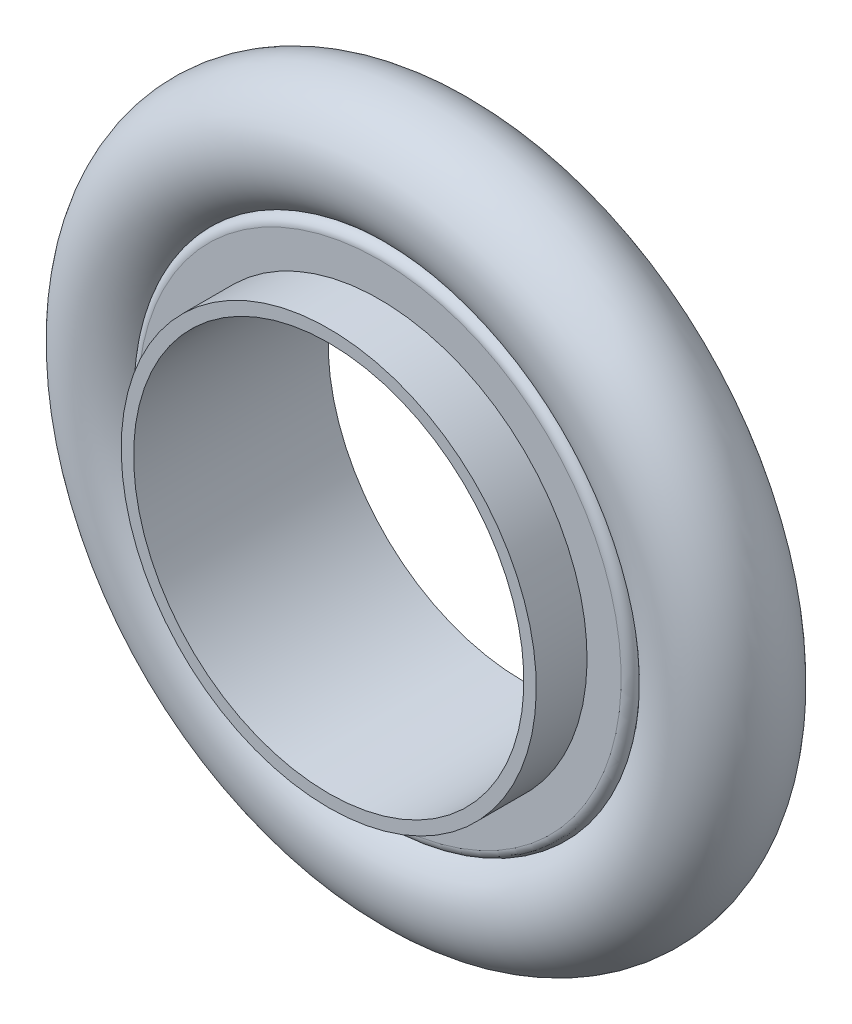
ISO-10303-21;
HEADER;
FILE_DESCRIPTION(('STEP AP214'),'2;1');
FILE_NAME('part.step','',(''),(''),'','','');
FILE_SCHEMA(('AUTOMOTIVE_DESIGN { 1 0 10303 214 1 1 1 1 }'));
ENDSEC;
DATA;
#1=APPLICATION_CONTEXT('core data for automotive mechanical design processes');
#2=APPLICATION_PROTOCOL_DEFINITION('international standard','automotive_design',2000,#1);
#3=PRODUCT_CONTEXT('',#1,'mechanical');
#4=PRODUCT('Part','Part','',(#3));
#5=PRODUCT_RELATED_PRODUCT_CATEGORY('part','',(#4));
#6=PRODUCT_DEFINITION_FORMATION('','',#4);
#7=PRODUCT_DEFINITION_CONTEXT('part definition',#1,'design');
#8=PRODUCT_DEFINITION('design','',#6,#7);
#9=PRODUCT_DEFINITION_SHAPE('','',#8);
#10=(LENGTH_UNIT() NAMED_UNIT(*) SI_UNIT(.MILLI.,.METRE.));
#11=(NAMED_UNIT(*) PLANE_ANGLE_UNIT() SI_UNIT($,.RADIAN.));
#12=(NAMED_UNIT(*) SI_UNIT($,.STERADIAN.) SOLID_ANGLE_UNIT());
#13=UNCERTAINTY_MEASURE_WITH_UNIT(LENGTH_MEASURE(1.E-05),#10,'distance_accuracy_value','');
#14=(GEOMETRIC_REPRESENTATION_CONTEXT(3) GLOBAL_UNCERTAINTY_ASSIGNED_CONTEXT((#13)) GLOBAL_UNIT_ASSIGNED_CONTEXT((#10,
#11,#12)) REPRESENTATION_CONTEXT('',''));
#15=CARTESIAN_POINT('',(0.,0.,0.));
#16=DIRECTION('',(0.,0.,1.));
#17=DIRECTION('',(1.,0.,0.));
#18=AXIS2_PLACEMENT_3D('',#15,#16,#17);
#19=CARTESIAN_POINT('',(0.,0.,0.));
#20=DIRECTION('',(0.,0.,1.));
#21=DIRECTION('',(0.,-1.,0.));
#22=AXIS2_PLACEMENT_3D('',#19,#20,#21);
#23=TOROIDAL_SURFACE('',#22,12.1613372824156,2.41572271758437);
#24=CARTESIAN_POINT('',(0.,-14.57706,0.));
#25=VERTEX_POINT('',#24);
#26=VERTEX_LOOP('',#25);
#27=FACE_BOUND('',#26,.T.);
#28=ADVANCED_FACE('F47',(#27),#23,.T.);
#29=CLOSED_SHELL('',(#28));
#30=MANIFOLD_SOLID_BREP('B2',#29);
#31=CARTESIAN_POINT('',(0.,0.,0.));
#32=DIRECTION('',(0.,0.,1.));
#33=DIRECTION('',(0.,-1.,0.));
#34=AXIS2_PLACEMENT_3D('',#31,#32,#33);
#35=TOROIDAL_SURFACE('',#34,12.1613372824156,2.41572271758437);
#36=CARTESIAN_POINT('',(0.,0.,1.524));
#37=DIRECTION('',(0.,0.,1.));
#38=DIRECTION('',(0.,-1.,0.));
#39=AXIS2_PLACEMENT_3D('',#36,#37,#38);
#40=CIRCLE('',#39,10.287);
#41=CARTESIAN_POINT('',(0.,-10.287,1.524));
#42=VERTEX_POINT('',#41);
#43=EDGE_CURVE('E46',#42,#42,#40,.T.);
#44=ORIENTED_EDGE('',*,*,#43,.F.);
#45=EDGE_LOOP('',(#44));
#46=FACE_BOUND('',#45,.T.);
#47=CARTESIAN_POINT('',(0.,0.,-1.524));
#48=DIRECTION('',(0.,0.,1.));
#49=DIRECTION('',(0.,-1.,0.));
#50=AXIS2_PLACEMENT_3D('',#47,#48,#49);
#51=CIRCLE('',#50,10.287);
#52=CARTESIAN_POINT('',(0.,-10.287,-1.524));
#53=VERTEX_POINT('',#52);
#54=EDGE_CURVE('E96',#53,#53,#51,.T.);
#55=ORIENTED_EDGE('',*,*,#54,.T.);
#56=EDGE_LOOP('',(#55));
#57=FACE_BOUND('',#56,.T.);
#58=ADVANCED_FACE('F62',(#46,#57),#35,.F.);
#59=CARTESIAN_POINT('',(0.,0.,1.524));
#60=DIRECTION('',(0.,0.,1.));
#61=DIRECTION('',(0.,-1.,0.));
#62=AXIS2_PLACEMENT_3D('',#59,#60,#61);
#63=TOROIDAL_SURFACE('',#62,9.90600000000001,0.380999999999998);
#64=CARTESIAN_POINT('',(0.,0.,1.905));
#65=DIRECTION('',(0.,0.,1.));
#66=DIRECTION('',(0.,-1.,0.));
#67=AXIS2_PLACEMENT_3D('',#64,#65,#66);
#68=CIRCLE('',#67,9.90600000000001);
#69=CARTESIAN_POINT('',(0.,-9.90600000000001,1.905));
#70=VERTEX_POINT('',#69);
#71=EDGE_CURVE('E68',#70,#70,#68,.T.);
#72=ORIENTED_EDGE('',*,*,#71,.F.);
#73=EDGE_LOOP('',(#72));
#74=FACE_BOUND('',#73,.T.);
#75=ORIENTED_EDGE('',*,*,#43,.T.);
#76=EDGE_LOOP('',(#75));
#77=FACE_BOUND('',#76,.T.);
#78=ADVANCED_FACE('F145',(#74,#77),#63,.T.);
#79=CARTESIAN_POINT('',(0.,8.509,1.905));
#80=DIRECTION('',(0.,0.,-1.));
#81=DIRECTION('',(0.,1.,0.));
#82=AXIS2_PLACEMENT_3D('',#79,#80,#81);
#83=PLANE('',#82);
#84=CARTESIAN_POINT('',(0.,0.,1.905));
#85=DIRECTION('',(0.,0.,1.));
#86=DIRECTION('',(0.,-1.,0.));
#87=AXIS2_PLACEMENT_3D('',#84,#85,#86);
#88=CIRCLE('',#87,8.509);
#89=CARTESIAN_POINT('',(0.,-8.509,1.905));
#90=VERTEX_POINT('',#89);
#91=EDGE_CURVE('E72',#90,#90,#88,.T.);
#92=ORIENTED_EDGE('',*,*,#91,.F.);
#93=EDGE_LOOP('',(#92));
#94=FACE_BOUND('',#93,.T.);
#95=ORIENTED_EDGE('',*,*,#71,.T.);
#96=EDGE_LOOP('',(#95));
#97=FACE_BOUND('',#96,.T.);
#98=ADVANCED_FACE('F140',(#94,#97),#83,.F.);
#99=CARTESIAN_POINT('',(0.,0.,3.9878));
#100=DIRECTION('',(0.,0.,1.));
#101=DIRECTION('',(0.,-1.,0.));
#102=AXIS2_PLACEMENT_3D('',#99,#100,#101);
#103=CYLINDRICAL_SURFACE('',#102,8.509);
#104=CARTESIAN_POINT('',(0.,0.,3.9878));
#105=DIRECTION('',(0.,0.,1.));
#106=DIRECTION('',(0.,-1.,0.));
#107=AXIS2_PLACEMENT_3D('',#104,#105,#106);
#108=CIRCLE('',#107,8.509);
#109=CARTESIAN_POINT('',(0.,-8.509,3.9878));
#110=VERTEX_POINT('',#109);
#111=EDGE_CURVE('E76',#110,#110,#108,.T.);
#112=ORIENTED_EDGE('',*,*,#111,.F.);
#113=EDGE_LOOP('',(#112));
#114=FACE_BOUND('',#113,.T.);
#115=ORIENTED_EDGE('',*,*,#91,.T.);
#116=EDGE_LOOP('',(#115));
#117=FACE_BOUND('',#116,.T.);
#118=ADVANCED_FACE('F134',(#114,#117),#103,.T.);
#119=CARTESIAN_POINT('',(0.,8.001,3.9878));
#120=DIRECTION('',(0.,0.,-1.));
#121=DIRECTION('',(0.,1.,0.));
#122=AXIS2_PLACEMENT_3D('',#119,#120,#121);
#123=PLANE('',#122);
#124=CARTESIAN_POINT('',(0.,0.,3.9878));
#125=DIRECTION('',(0.,0.,1.));
#126=DIRECTION('',(0.,-1.,0.));
#127=AXIS2_PLACEMENT_3D('',#124,#125,#126);
#128=CIRCLE('',#127,8.001);
#129=CARTESIAN_POINT('',(0.,-8.001,3.9878));
#130=VERTEX_POINT('',#129);
#131=EDGE_CURVE('E81',#130,#130,#128,.T.);
#132=ORIENTED_EDGE('',*,*,#131,.F.);
#133=EDGE_LOOP('',(#132));
#134=FACE_BOUND('',#133,.T.);
#135=ORIENTED_EDGE('',*,*,#111,.T.);
#136=EDGE_LOOP('',(#135));
#137=FACE_BOUND('',#136,.T.);
#138=ADVANCED_FACE('F128',(#134,#137),#123,.F.);
#139=CARTESIAN_POINT('',(0.,0.,3.9878));
#140=DIRECTION('',(0.,0.,1.));
#141=DIRECTION('',(0.,-1.,0.));
#142=AXIS2_PLACEMENT_3D('',#139,#140,#141);
#143=CYLINDRICAL_SURFACE('',#142,8.001);
#144=CARTESIAN_POINT('',(0.,0.,-3.9878));
#145=DIRECTION('',(0.,0.,1.));
#146=DIRECTION('',(0.,-1.,0.));
#147=AXIS2_PLACEMENT_3D('',#144,#145,#146);
#148=CIRCLE('',#147,8.001);
#149=CARTESIAN_POINT('',(0.,-8.001,-3.9878));
#150=VERTEX_POINT('',#149);
#151=EDGE_CURVE('E84',#150,#150,#148,.T.);
#152=ORIENTED_EDGE('',*,*,#151,.F.);
#153=EDGE_LOOP('',(#152));
#154=FACE_BOUND('',#153,.T.);
#155=ORIENTED_EDGE('',*,*,#131,.T.);
#156=EDGE_LOOP('',(#155));
#157=FACE_BOUND('',#156,.T.);
#158=ADVANCED_FACE('F122',(#154,#157),#143,.F.);
#159=CARTESIAN_POINT('',(0.,8.001,-3.9878));
#160=DIRECTION('',(0.,0.,1.));
#161=DIRECTION('',(0.,-1.,0.));
#162=AXIS2_PLACEMENT_3D('',#159,#160,#161);
#163=PLANE('',#162);
#164=CARTESIAN_POINT('',(0.,0.,-3.9878));
#165=DIRECTION('',(0.,0.,1.));
#166=DIRECTION('',(0.,-1.,0.));
#167=AXIS2_PLACEMENT_3D('',#164,#165,#166);
#168=CIRCLE('',#167,8.509);
#169=CARTESIAN_POINT('',(0.,-8.509,-3.9878));
#170=VERTEX_POINT('',#169);
#171=EDGE_CURVE('E87',#170,#170,#168,.T.);
#172=ORIENTED_EDGE('',*,*,#171,.F.);
#173=EDGE_LOOP('',(#172));
#174=FACE_BOUND('',#173,.T.);
#175=ORIENTED_EDGE('',*,*,#151,.T.);
#176=EDGE_LOOP('',(#175));
#177=FACE_BOUND('',#176,.T.);
#178=ADVANCED_FACE('F116',(#174,#177),#163,.F.);
#179=CARTESIAN_POINT('',(0.,0.,3.9878));
#180=DIRECTION('',(0.,0.,1.));
#181=DIRECTION('',(0.,-1.,0.));
#182=AXIS2_PLACEMENT_3D('',#179,#180,#181);
#183=CYLINDRICAL_SURFACE('',#182,8.509);
#184=CARTESIAN_POINT('',(0.,0.,-1.905));
#185=DIRECTION('',(0.,0.,1.));
#186=DIRECTION('',(0.,-1.,0.));
#187=AXIS2_PLACEMENT_3D('',#184,#185,#186);
#188=CIRCLE('',#187,8.509);
#189=CARTESIAN_POINT('',(0.,-8.509,-1.905));
#190=VERTEX_POINT('',#189);
#191=EDGE_CURVE('E90',#190,#190,#188,.T.);
#192=ORIENTED_EDGE('',*,*,#191,.F.);
#193=EDGE_LOOP('',(#192));
#194=FACE_BOUND('',#193,.T.);
#195=ORIENTED_EDGE('',*,*,#171,.T.);
#196=EDGE_LOOP('',(#195));
#197=FACE_BOUND('',#196,.T.);
#198=ADVANCED_FACE('F110',(#194,#197),#183,.T.);
#199=CARTESIAN_POINT('',(0.,8.509,-1.905));
#200=DIRECTION('',(0.,0.,1.));
#201=DIRECTION('',(0.,-1.,0.));
#202=AXIS2_PLACEMENT_3D('',#199,#200,#201);
#203=PLANE('',#202);
#204=CARTESIAN_POINT('',(0.,0.,-1.905));
#205=DIRECTION('',(0.,0.,1.));
#206=DIRECTION('',(0.,-1.,0.));
#207=AXIS2_PLACEMENT_3D('',#204,#205,#206);
#208=CIRCLE('',#207,9.90600000000001);
#209=CARTESIAN_POINT('',(0.,-9.90600000000001,-1.905));
#210=VERTEX_POINT('',#209);
#211=EDGE_CURVE('E93',#210,#210,#208,.T.);
#212=ORIENTED_EDGE('',*,*,#211,.F.);
#213=EDGE_LOOP('',(#212));
#214=FACE_BOUND('',#213,.T.);
#215=ORIENTED_EDGE('',*,*,#191,.T.);
#216=EDGE_LOOP('',(#215));
#217=FACE_BOUND('',#216,.T.);
#218=ADVANCED_FACE('F104',(#214,#217),#203,.F.);
#219=CARTESIAN_POINT('',(0.,0.,-1.524));
#220=DIRECTION('',(0.,0.,1.));
#221=DIRECTION('',(0.,-1.,0.));
#222=AXIS2_PLACEMENT_3D('',#219,#220,#221);
#223=TOROIDAL_SURFACE('',#222,9.90600000000001,0.380999999999998);
#224=ORIENTED_EDGE('',*,*,#54,.F.);
#225=EDGE_LOOP('',(#224));
#226=FACE_BOUND('',#225,.T.);
#227=ORIENTED_EDGE('',*,*,#211,.T.);
#228=EDGE_LOOP('',(#227));
#229=FACE_BOUND('',#228,.T.);
#230=ADVANCED_FACE('F101',(#226,#229),#223,.T.);
#231=CLOSED_SHELL('',(#58,#78,#98,#118,#138,#158,#178,#198,#218,#230));
#232=MANIFOLD_SOLID_BREP('B6',#231);
#233=ADVANCED_BREP_SHAPE_REPRESENTATION('',(#18,#30,#232),#14);
#234=SHAPE_DEFINITION_REPRESENTATION(#9,#233);
ENDSEC;
END-ISO-10303-21;
